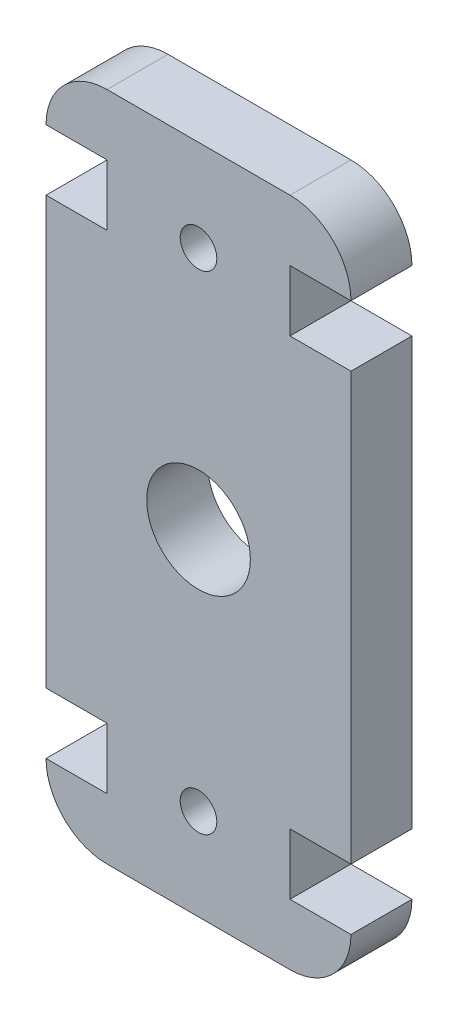
ISO-10303-21;
HEADER;
FILE_DESCRIPTION(('STEP AP214'),'2;1');
FILE_NAME('part.step','',(''),(''),'','','');
FILE_SCHEMA(('AUTOMOTIVE_DESIGN { 1 0 10303 214 1 1 1 1 }'));
ENDSEC;
DATA;
#1=APPLICATION_CONTEXT('core data for automotive mechanical design processes');
#2=APPLICATION_PROTOCOL_DEFINITION('international standard','automotive_design',2000,#1);
#3=PRODUCT_CONTEXT('',#1,'mechanical');
#4=PRODUCT('Part','Part','',(#3));
#5=PRODUCT_RELATED_PRODUCT_CATEGORY('part','',(#4));
#6=PRODUCT_DEFINITION_FORMATION('','',#4);
#7=PRODUCT_DEFINITION_CONTEXT('part definition',#1,'design');
#8=PRODUCT_DEFINITION('design','',#6,#7);
#9=PRODUCT_DEFINITION_SHAPE('','',#8);
#10=(LENGTH_UNIT() NAMED_UNIT(*) SI_UNIT(.MILLI.,.METRE.));
#11=(NAMED_UNIT(*) PLANE_ANGLE_UNIT() SI_UNIT($,.RADIAN.));
#12=(NAMED_UNIT(*) SI_UNIT($,.STERADIAN.) SOLID_ANGLE_UNIT());
#13=UNCERTAINTY_MEASURE_WITH_UNIT(LENGTH_MEASURE(1.E-05),#10,'distance_accuracy_value','');
#14=(GEOMETRIC_REPRESENTATION_CONTEXT(3) GLOBAL_UNCERTAINTY_ASSIGNED_CONTEXT((#13)) GLOBAL_UNIT_ASSIGNED_CONTEXT((#10,
#11,#12)) REPRESENTATION_CONTEXT('',''));
#15=CARTESIAN_POINT('',(0.,0.,0.));
#16=DIRECTION('',(0.,0.,1.));
#17=DIRECTION('',(1.,0.,0.));
#18=AXIS2_PLACEMENT_3D('',#15,#16,#17);
#19=CARTESIAN_POINT('',(0.,0.,5.));
#20=DIRECTION('',(0.,0.,1.));
#21=DIRECTION('',(1.,0.,0.));
#22=AXIS2_PLACEMENT_3D('',#19,#20,#21);
#23=PLANE('',#22);
#24=CARTESIAN_POINT('',(0.,7.5,5.));
#25=DIRECTION('',(0.,0.,1.));
#26=DIRECTION('',(1.,0.,0.));
#27=AXIS2_PLACEMENT_3D('',#24,#25,#26);
#28=CIRCLE('',#27,1.5);
#29=CARTESIAN_POINT('',(1.5,7.5,5.));
#30=VERTEX_POINT('',#29);
#31=EDGE_CURVE('E473',#30,#30,#28,.T.);
#32=ORIENTED_EDGE('',*,*,#31,.F.);
#33=EDGE_LOOP('',(#32));
#34=FACE_BOUND('',#33,.T.);
#35=DIRECTION('',(1.,0.,0.));
#36=VECTOR('',#35,1.);
#37=CARTESIAN_POINT('',(7.50000000000002,50.,5.));
#38=LINE('',#37,#36);
#39=CARTESIAN_POINT('',(7.50000000000002,50.,5.));
#40=VERTEX_POINT('',#39);
#41=CARTESIAN_POINT('',(12.4999999999999,50.,5.));
#42=VERTEX_POINT('',#41);
#43=EDGE_CURVE('E325',#40,#42,#38,.T.);
#44=ORIENTED_EDGE('',*,*,#43,.T.);
#45=CARTESIAN_POINT('',(7.49999999999994,50.,5.));
#46=DIRECTION('',(0.,0.,1.));
#47=DIRECTION('',(1.,0.,0.));
#48=AXIS2_PLACEMENT_3D('',#45,#46,#47);
#49=CIRCLE('',#48,5.);
#50=CARTESIAN_POINT('',(7.49999999999994,55.,5.));
#51=VERTEX_POINT('',#50);
#52=EDGE_CURVE('E174',#42,#51,#49,.T.);
#53=ORIENTED_EDGE('',*,*,#52,.T.);
#54=DIRECTION('',(-1.,0.,0.));
#55=VECTOR('',#54,1.);
#56=CARTESIAN_POINT('',(12.5,55.,5.));
#57=LINE('',#56,#55);
#58=CARTESIAN_POINT('',(-7.49999999999994,55.,5.));
#59=VERTEX_POINT('',#58);
#60=EDGE_CURVE('E331',#51,#59,#57,.T.);
#61=ORIENTED_EDGE('',*,*,#60,.T.);
#62=CARTESIAN_POINT('',(-7.49999999999994,50.,5.));
#63=DIRECTION('',(0.,0.,1.));
#64=DIRECTION('',(1.,0.,0.));
#65=AXIS2_PLACEMENT_3D('',#62,#63,#64);
#66=CIRCLE('',#65,5.);
#67=CARTESIAN_POINT('',(-12.4999999999999,50.,5.));
#68=VERTEX_POINT('',#67);
#69=EDGE_CURVE('E205',#59,#68,#66,.T.);
#70=ORIENTED_EDGE('',*,*,#69,.T.);
#71=DIRECTION('',(1.,0.,0.));
#72=VECTOR('',#71,1.);
#73=CARTESIAN_POINT('',(-12.4999999999999,50.,5.));
#74=LINE('',#73,#72);
#75=CARTESIAN_POINT('',(-7.50000000000013,50.,5.));
#76=VERTEX_POINT('',#75);
#77=EDGE_CURVE('E334',#68,#76,#74,.T.);
#78=ORIENTED_EDGE('',*,*,#77,.T.);
#79=DIRECTION('',(0.,-1.,0.));
#80=VECTOR('',#79,1.);
#81=CARTESIAN_POINT('',(-7.50000000000013,50.,5.));
#82=LINE('',#81,#80);
#83=CARTESIAN_POINT('',(-7.50000000000013,45.,5.));
#84=VERTEX_POINT('',#83);
#85=EDGE_CURVE('E336',#76,#84,#82,.T.);
#86=ORIENTED_EDGE('',*,*,#85,.T.);
#87=DIRECTION('',(-1.,0.,0.));
#88=VECTOR('',#87,1.);
#89=CARTESIAN_POINT('',(-7.50000000000013,45.,5.));
#90=LINE('',#89,#88);
#91=CARTESIAN_POINT('',(-12.4999999999999,45.,5.));
#92=VERTEX_POINT('',#91);
#93=EDGE_CURVE('E338',#84,#92,#90,.T.);
#94=ORIENTED_EDGE('',*,*,#93,.T.);
#95=DIRECTION('',(0.,-1.,0.));
#96=VECTOR('',#95,1.);
#97=CARTESIAN_POINT('',(-12.4999999999999,45.,5.));
#98=LINE('',#97,#96);
#99=CARTESIAN_POINT('',(-12.4999999999999,9.99999999999999,5.));
#100=VERTEX_POINT('',#99);
#101=EDGE_CURVE('E340',#92,#100,#98,.T.);
#102=ORIENTED_EDGE('',*,*,#101,.T.);
#103=DIRECTION('',(1.,0.,0.));
#104=VECTOR('',#103,1.);
#105=CARTESIAN_POINT('',(-12.4999999999999,9.99999999999999,5.));
#106=LINE('',#105,#104);
#107=CARTESIAN_POINT('',(-7.50000000000014,9.99999999999999,5.));
#108=VERTEX_POINT('',#107);
#109=EDGE_CURVE('E342',#100,#108,#106,.T.);
#110=ORIENTED_EDGE('',*,*,#109,.T.);
#111=DIRECTION('',(0.,-1.,0.));
#112=VECTOR('',#111,1.);
#113=CARTESIAN_POINT('',(-7.50000000000014,9.99999999999999,5.));
#114=LINE('',#113,#112);
#115=CARTESIAN_POINT('',(-7.49999999999997,5.,5.));
#116=VERTEX_POINT('',#115);
#117=EDGE_CURVE('E343',#108,#116,#114,.T.);
#118=ORIENTED_EDGE('',*,*,#117,.T.);
#119=DIRECTION('',(-1.,0.,0.));
#120=VECTOR('',#119,1.);
#121=CARTESIAN_POINT('',(-7.49999999999997,5.,5.));
#122=LINE('',#121,#120);
#123=CARTESIAN_POINT('',(-12.4999999999999,5.,5.));
#124=VERTEX_POINT('',#123);
#125=EDGE_CURVE('E229',#116,#124,#122,.T.);
#126=ORIENTED_EDGE('',*,*,#125,.T.);
#127=CARTESIAN_POINT('',(-7.49999999999994,5.,5.));
#128=DIRECTION('',(0.,0.,1.));
#129=DIRECTION('',(1.,0.,0.));
#130=AXIS2_PLACEMENT_3D('',#127,#128,#129);
#131=CIRCLE('',#130,5.);
#132=CARTESIAN_POINT('',(-7.49999999999994,0.,5.));
#133=VERTEX_POINT('',#132);
#134=EDGE_CURVE('E52',#124,#133,#131,.T.);
#135=ORIENTED_EDGE('',*,*,#134,.T.);
#136=DIRECTION('',(1.,0.,0.));
#137=VECTOR('',#136,1.);
#138=CARTESIAN_POINT('',(-12.4999999999999,0.,5.));
#139=LINE('',#138,#137);
#140=CARTESIAN_POINT('',(7.49999999999994,0.,5.));
#141=VERTEX_POINT('',#140);
#142=EDGE_CURVE('E171',#133,#141,#139,.T.);
#143=ORIENTED_EDGE('',*,*,#142,.T.);
#144=CARTESIAN_POINT('',(7.49999999999994,5.,5.));
#145=DIRECTION('',(0.,0.,1.));
#146=DIRECTION('',(1.,0.,0.));
#147=AXIS2_PLACEMENT_3D('',#144,#145,#146);
#148=CIRCLE('',#147,5.);
#149=CARTESIAN_POINT('',(12.4999999999999,5.,5.));
#150=VERTEX_POINT('',#149);
#151=EDGE_CURVE('E166',#141,#150,#148,.T.);
#152=ORIENTED_EDGE('',*,*,#151,.T.);
#153=DIRECTION('',(-1.,0.,0.));
#154=VECTOR('',#153,1.);
#155=CARTESIAN_POINT('',(12.4999999999999,5.,5.));
#156=LINE('',#155,#154);
#157=CARTESIAN_POINT('',(7.50000000000003,5.,5.));
#158=VERTEX_POINT('',#157);
#159=EDGE_CURVE('E169',#150,#158,#156,.T.);
#160=ORIENTED_EDGE('',*,*,#159,.T.);
#161=DIRECTION('',(0.,1.,0.));
#162=VECTOR('',#161,1.);
#163=CARTESIAN_POINT('',(7.50000000000003,5.,5.));
#164=LINE('',#163,#162);
#165=CARTESIAN_POINT('',(7.50000000000002,10.,5.));
#166=VERTEX_POINT('',#165);
#167=EDGE_CURVE('E184',#158,#166,#164,.T.);
#168=ORIENTED_EDGE('',*,*,#167,.T.);
#169=DIRECTION('',(1.,0.,0.));
#170=VECTOR('',#169,1.);
#171=CARTESIAN_POINT('',(7.50000000000002,10.,5.));
#172=LINE('',#171,#170);
#173=CARTESIAN_POINT('',(12.4999999999999,9.99999999999999,5.));
#174=VERTEX_POINT('',#173);
#175=EDGE_CURVE('E306',#166,#174,#172,.T.);
#176=ORIENTED_EDGE('',*,*,#175,.T.);
#177=DIRECTION('',(0.,1.,0.));
#178=VECTOR('',#177,1.);
#179=CARTESIAN_POINT('',(12.4999999999999,9.99999999999999,5.));
#180=LINE('',#179,#178);
#181=CARTESIAN_POINT('',(12.4999999999999,45.,5.));
#182=VERTEX_POINT('',#181);
#183=EDGE_CURVE('E323',#174,#182,#180,.T.);
#184=ORIENTED_EDGE('',*,*,#183,.T.);
#185=DIRECTION('',(-1.,0.,0.));
#186=VECTOR('',#185,1.);
#187=CARTESIAN_POINT('',(12.4999999999999,45.,5.));
#188=LINE('',#187,#186);
#189=CARTESIAN_POINT('',(7.50000000000006,45.,5.));
#190=VERTEX_POINT('',#189);
#191=EDGE_CURVE('E320',#182,#190,#188,.T.);
#192=ORIENTED_EDGE('',*,*,#191,.T.);
#193=DIRECTION('',(0.,1.,0.));
#194=VECTOR('',#193,1.);
#195=CARTESIAN_POINT('',(7.50000000000006,45.,5.));
#196=LINE('',#195,#194);
#197=EDGE_CURVE('E322',#190,#40,#196,.T.);
#198=ORIENTED_EDGE('',*,*,#197,.T.);
#199=EDGE_LOOP('',(#44,#53,#61,#70,#78,#86,#94,#102,#110,#118,#126,#135,#143,#152,#160,#168,
#176,#184,#192,#198));
#200=FACE_BOUND('',#199,.T.);
#201=CARTESIAN_POINT('',(0.,47.5000000000001,5.));
#202=DIRECTION('',(0.,0.,1.));
#203=DIRECTION('',(1.,0.,0.));
#204=AXIS2_PLACEMENT_3D('',#201,#202,#203);
#205=CIRCLE('',#204,1.5);
#206=CARTESIAN_POINT('',(1.5,47.5000000000001,5.));
#207=VERTEX_POINT('',#206);
#208=EDGE_CURVE('E221',#207,#207,#205,.T.);
#209=ORIENTED_EDGE('',*,*,#208,.F.);
#210=EDGE_LOOP('',(#209));
#211=FACE_BOUND('',#210,.T.);
#212=CARTESIAN_POINT('',(0.,27.5000000000001,5.));
#213=DIRECTION('',(0.,0.,1.));
#214=DIRECTION('',(1.,0.,0.));
#215=AXIS2_PLACEMENT_3D('',#212,#213,#214);
#216=CIRCLE('',#215,4.25);
#217=CARTESIAN_POINT('',(4.25,27.5000000000001,5.));
#218=VERTEX_POINT('',#217);
#219=EDGE_CURVE('E464',#218,#218,#216,.T.);
#220=ORIENTED_EDGE('',*,*,#219,.F.);
#221=EDGE_LOOP('',(#220));
#222=FACE_BOUND('',#221,.T.);
#223=ADVANCED_FACE('F32',(#34,#200,#211,#222),#23,.T.);
#224=CARTESIAN_POINT('',(0.,0.,0.));
#225=DIRECTION('',(0.,0.,1.));
#226=DIRECTION('',(1.,0.,0.));
#227=AXIS2_PLACEMENT_3D('',#224,#225,#226);
#228=PLANE('',#227);
#229=DIRECTION('',(-1.,0.,0.));
#230=VECTOR('',#229,1.);
#231=CARTESIAN_POINT('',(12.5,55.,0.));
#232=LINE('',#231,#230);
#233=CARTESIAN_POINT('',(7.49999999999994,55.,0.));
#234=VERTEX_POINT('',#233);
#235=CARTESIAN_POINT('',(-7.49999999999994,55.,0.));
#236=VERTEX_POINT('',#235);
#237=EDGE_CURVE('E244',#234,#236,#232,.T.);
#238=ORIENTED_EDGE('',*,*,#237,.F.);
#239=CARTESIAN_POINT('',(7.49999999999994,50.,0.));
#240=DIRECTION('',(0.,0.,1.));
#241=DIRECTION('',(1.,0.,0.));
#242=AXIS2_PLACEMENT_3D('',#239,#240,#241);
#243=CIRCLE('',#242,5.);
#244=CARTESIAN_POINT('',(12.4999999999999,50.,0.));
#245=VERTEX_POINT('',#244);
#246=EDGE_CURVE('E203',#234,#245,#243,.F.);
#247=ORIENTED_EDGE('',*,*,#246,.T.);
#248=DIRECTION('',(1.,0.,0.));
#249=VECTOR('',#248,1.);
#250=CARTESIAN_POINT('',(7.50000000000002,50.,0.));
#251=LINE('',#250,#249);
#252=CARTESIAN_POINT('',(7.50000000000002,50.,0.));
#253=VERTEX_POINT('',#252);
#254=EDGE_CURVE('E241',#253,#245,#251,.T.);
#255=ORIENTED_EDGE('',*,*,#254,.F.);
#256=DIRECTION('',(0.,1.,0.));
#257=VECTOR('',#256,1.);
#258=CARTESIAN_POINT('',(7.50000000000006,45.,0.));
#259=LINE('',#258,#257);
#260=CARTESIAN_POINT('',(7.50000000000006,45.,0.));
#261=VERTEX_POINT('',#260);
#262=EDGE_CURVE('E239',#261,#253,#259,.T.);
#263=ORIENTED_EDGE('',*,*,#262,.F.);
#264=DIRECTION('',(-1.,0.,0.));
#265=VECTOR('',#264,1.);
#266=CARTESIAN_POINT('',(12.4999999999999,45.,0.));
#267=LINE('',#266,#265);
#268=CARTESIAN_POINT('',(12.4999999999999,45.,0.));
#269=VERTEX_POINT('',#268);
#270=EDGE_CURVE('E237',#269,#261,#267,.T.);
#271=ORIENTED_EDGE('',*,*,#270,.F.);
#272=DIRECTION('',(0.,1.,0.));
#273=VECTOR('',#272,1.);
#274=CARTESIAN_POINT('',(12.4999999999999,9.99999999999999,0.));
#275=LINE('',#274,#273);
#276=CARTESIAN_POINT('',(12.4999999999999,9.99999999999999,0.));
#277=VERTEX_POINT('',#276);
#278=EDGE_CURVE('E235',#277,#269,#275,.T.);
#279=ORIENTED_EDGE('',*,*,#278,.F.);
#280=DIRECTION('',(1.,0.,0.));
#281=VECTOR('',#280,1.);
#282=CARTESIAN_POINT('',(7.50000000000002,10.,0.));
#283=LINE('',#282,#281);
#284=CARTESIAN_POINT('',(7.50000000000002,10.,0.));
#285=VERTEX_POINT('',#284);
#286=EDGE_CURVE('E233',#285,#277,#283,.T.);
#287=ORIENTED_EDGE('',*,*,#286,.F.);
#288=DIRECTION('',(0.,1.,0.));
#289=VECTOR('',#288,1.);
#290=CARTESIAN_POINT('',(7.50000000000003,5.,0.));
#291=LINE('',#290,#289);
#292=CARTESIAN_POINT('',(7.50000000000003,5.,0.));
#293=VERTEX_POINT('',#292);
#294=EDGE_CURVE('E223',#293,#285,#291,.T.);
#295=ORIENTED_EDGE('',*,*,#294,.F.);
#296=DIRECTION('',(-1.,0.,0.));
#297=VECTOR('',#296,1.);
#298=CARTESIAN_POINT('',(12.4999999999999,5.,0.));
#299=LINE('',#298,#297);
#300=CARTESIAN_POINT('',(12.4999999999999,5.,0.));
#301=VERTEX_POINT('',#300);
#302=EDGE_CURVE('E220',#301,#293,#299,.T.);
#303=ORIENTED_EDGE('',*,*,#302,.F.);
#304=CARTESIAN_POINT('',(7.49999999999994,5.,0.));
#305=DIRECTION('',(0.,0.,1.));
#306=DIRECTION('',(1.,0.,0.));
#307=AXIS2_PLACEMENT_3D('',#304,#305,#306);
#308=CIRCLE('',#307,5.);
#309=CARTESIAN_POINT('',(7.49999999999994,0.,0.));
#310=VERTEX_POINT('',#309);
#311=EDGE_CURVE('E187',#301,#310,#308,.F.);
#312=ORIENTED_EDGE('',*,*,#311,.T.);
#313=DIRECTION('',(1.,0.,0.));
#314=VECTOR('',#313,1.);
#315=CARTESIAN_POINT('',(-12.4999999999999,0.,0.));
#316=LINE('',#315,#314);
#317=CARTESIAN_POINT('',(-7.49999999999994,0.,0.));
#318=VERTEX_POINT('',#317);
#319=EDGE_CURVE('E212',#318,#310,#316,.T.);
#320=ORIENTED_EDGE('',*,*,#319,.F.);
#321=CARTESIAN_POINT('',(-7.49999999999994,5.,0.));
#322=DIRECTION('',(0.,0.,1.));
#323=DIRECTION('',(1.,0.,0.));
#324=AXIS2_PLACEMENT_3D('',#321,#322,#323);
#325=CIRCLE('',#324,5.);
#326=CARTESIAN_POINT('',(-12.4999999999999,5.,0.));
#327=VERTEX_POINT('',#326);
#328=EDGE_CURVE('E200',#318,#327,#325,.F.);
#329=ORIENTED_EDGE('',*,*,#328,.T.);
#330=DIRECTION('',(-1.,0.,0.));
#331=VECTOR('',#330,1.);
#332=CARTESIAN_POINT('',(-7.49999999999997,5.,0.));
#333=LINE('',#332,#331);
#334=CARTESIAN_POINT('',(-7.49999999999997,5.,0.));
#335=VERTEX_POINT('',#334);
#336=EDGE_CURVE('E259',#335,#327,#333,.T.);
#337=ORIENTED_EDGE('',*,*,#336,.F.);
#338=DIRECTION('',(0.,-1.,0.));
#339=VECTOR('',#338,1.);
#340=CARTESIAN_POINT('',(-7.50000000000014,9.99999999999999,0.));
#341=LINE('',#340,#339);
#342=CARTESIAN_POINT('',(-7.50000000000014,9.99999999999999,0.));
#343=VERTEX_POINT('',#342);
#344=EDGE_CURVE('E257',#343,#335,#341,.T.);
#345=ORIENTED_EDGE('',*,*,#344,.F.);
#346=DIRECTION('',(1.,0.,0.));
#347=VECTOR('',#346,1.);
#348=CARTESIAN_POINT('',(-12.4999999999999,9.99999999999999,0.));
#349=LINE('',#348,#347);
#350=CARTESIAN_POINT('',(-12.4999999999999,9.99999999999999,0.));
#351=VERTEX_POINT('',#350);
#352=EDGE_CURVE('E255',#351,#343,#349,.T.);
#353=ORIENTED_EDGE('',*,*,#352,.F.);
#354=DIRECTION('',(0.,-1.,0.));
#355=VECTOR('',#354,1.);
#356=CARTESIAN_POINT('',(-12.4999999999999,45.,0.));
#357=LINE('',#356,#355);
#358=CARTESIAN_POINT('',(-12.4999999999999,45.,0.));
#359=VERTEX_POINT('',#358);
#360=EDGE_CURVE('E253',#359,#351,#357,.T.);
#361=ORIENTED_EDGE('',*,*,#360,.F.);
#362=DIRECTION('',(-1.,0.,0.));
#363=VECTOR('',#362,1.);
#364=CARTESIAN_POINT('',(-7.50000000000013,45.,0.));
#365=LINE('',#364,#363);
#366=CARTESIAN_POINT('',(-7.50000000000013,45.,0.));
#367=VERTEX_POINT('',#366);
#368=EDGE_CURVE('E251',#367,#359,#365,.T.);
#369=ORIENTED_EDGE('',*,*,#368,.F.);
#370=DIRECTION('',(0.,-1.,0.));
#371=VECTOR('',#370,1.);
#372=CARTESIAN_POINT('',(-7.50000000000013,50.,0.));
#373=LINE('',#372,#371);
#374=CARTESIAN_POINT('',(-7.50000000000013,50.,0.));
#375=VERTEX_POINT('',#374);
#376=EDGE_CURVE('E249',#375,#367,#373,.T.);
#377=ORIENTED_EDGE('',*,*,#376,.F.);
#378=DIRECTION('',(1.,0.,0.));
#379=VECTOR('',#378,1.);
#380=CARTESIAN_POINT('',(-12.4999999999999,50.,0.));
#381=LINE('',#380,#379);
#382=CARTESIAN_POINT('',(-12.4999999999999,50.,0.));
#383=VERTEX_POINT('',#382);
#384=EDGE_CURVE('E247',#383,#375,#381,.T.);
#385=ORIENTED_EDGE('',*,*,#384,.F.);
#386=CARTESIAN_POINT('',(-7.49999999999994,50.,0.));
#387=DIRECTION('',(0.,0.,1.));
#388=DIRECTION('',(1.,0.,0.));
#389=AXIS2_PLACEMENT_3D('',#386,#387,#388);
#390=CIRCLE('',#389,5.);
#391=EDGE_CURVE('E198',#383,#236,#390,.F.);
#392=ORIENTED_EDGE('',*,*,#391,.T.);
#393=EDGE_LOOP('',(#238,#247,#255,#263,#271,#279,#287,#295,#303,#312,#320,#329,#337,#345,#353,
#361,#369,#377,#385,#392));
#394=FACE_BOUND('',#393,.T.);
#395=CARTESIAN_POINT('',(0.,47.5000000000001,0.));
#396=DIRECTION('',(0.,0.,1.));
#397=DIRECTION('',(1.,0.,0.));
#398=AXIS2_PLACEMENT_3D('',#395,#396,#397);
#399=CIRCLE('',#398,1.5);
#400=CARTESIAN_POINT('',(1.5,47.5000000000001,0.));
#401=VERTEX_POINT('',#400);
#402=EDGE_CURVE('E226',#401,#401,#399,.T.);
#403=ORIENTED_EDGE('',*,*,#402,.T.);
#404=EDGE_LOOP('',(#403));
#405=FACE_BOUND('',#404,.T.);
#406=CARTESIAN_POINT('',(0.,7.5,0.));
#407=DIRECTION('',(0.,0.,1.));
#408=DIRECTION('',(1.,0.,0.));
#409=AXIS2_PLACEMENT_3D('',#406,#407,#408);
#410=CIRCLE('',#409,1.5);
#411=CARTESIAN_POINT('',(1.5,7.5,0.));
#412=VERTEX_POINT('',#411);
#413=EDGE_CURVE('E470',#412,#412,#410,.T.);
#414=ORIENTED_EDGE('',*,*,#413,.T.);
#415=EDGE_LOOP('',(#414));
#416=FACE_BOUND('',#415,.T.);
#417=CARTESIAN_POINT('',(0.,27.5000000000001,0.));
#418=DIRECTION('',(0.,0.,1.));
#419=DIRECTION('',(1.,0.,0.));
#420=AXIS2_PLACEMENT_3D('',#417,#418,#419);
#421=CIRCLE('',#420,4.25);
#422=CARTESIAN_POINT('',(4.25,27.5000000000001,0.));
#423=VERTEX_POINT('',#422);
#424=EDGE_CURVE('E467',#423,#423,#421,.T.);
#425=ORIENTED_EDGE('',*,*,#424,.T.);
#426=EDGE_LOOP('',(#425));
#427=FACE_BOUND('',#426,.T.);
#428=ADVANCED_FACE('F216',(#394,#405,#416,#427),#228,.F.);
#429=CARTESIAN_POINT('',(-12.4999999999999,0.,5.));
#430=DIRECTION('',(0.,1.,0.));
#431=DIRECTION('',(0.,0.,1.));
#432=AXIS2_PLACEMENT_3D('',#429,#430,#431);
#433=PLANE('',#432);
#434=ORIENTED_EDGE('',*,*,#319,.T.);
#435=DIRECTION('',(0.,0.,-1.));
#436=VECTOR('',#435,1.);
#437=CARTESIAN_POINT('',(7.49999999999994,0.,5.));
#438=LINE('',#437,#436);
#439=EDGE_CURVE('E11',#310,#141,#438,.F.);
#440=ORIENTED_EDGE('',*,*,#439,.T.);
#441=ORIENTED_EDGE('',*,*,#142,.F.);
#442=DIRECTION('',(0.,0.,-1.));
#443=VECTOR('',#442,1.);
#444=CARTESIAN_POINT('',(-7.49999999999994,0.,5.));
#445=LINE('',#444,#443);
#446=EDGE_CURVE('E40',#133,#318,#445,.T.);
#447=ORIENTED_EDGE('',*,*,#446,.T.);
#448=EDGE_LOOP('',(#434,#440,#441,#447));
#449=FACE_BOUND('',#448,.T.);
#450=ADVANCED_FACE('F211',(#449),#433,.F.);
#451=CARTESIAN_POINT('',(12.4999999999999,5.,5.));
#452=DIRECTION('',(0.,-1.,0.));
#453=DIRECTION('',(1.,0.,0.));
#454=AXIS2_PLACEMENT_3D('',#451,#452,#453);
#455=PLANE('',#454);
#456=ORIENTED_EDGE('',*,*,#302,.T.);
#457=DIRECTION('',(0.,0.,-1.));
#458=VECTOR('',#457,1.);
#459=CARTESIAN_POINT('',(7.50000000000003,5.,5.));
#460=LINE('',#459,#458);
#461=EDGE_CURVE('E182',#158,#293,#460,.T.);
#462=ORIENTED_EDGE('',*,*,#461,.F.);
#463=ORIENTED_EDGE('',*,*,#159,.F.);
#464=DIRECTION('',(0.,0.,-1.));
#465=VECTOR('',#464,1.);
#466=CARTESIAN_POINT('',(12.4999999999999,5.,5.));
#467=LINE('',#466,#465);
#468=EDGE_CURVE('E179',#150,#301,#467,.T.);
#469=ORIENTED_EDGE('',*,*,#468,.T.);
#470=EDGE_LOOP('',(#456,#462,#463,#469));
#471=FACE_BOUND('',#470,.T.);
#472=ADVANCED_FACE('F178',(#471),#455,.F.);
#473=CARTESIAN_POINT('',(7.50000000000003,5.,5.));
#474=DIRECTION('',(-1.,0.,0.));
#475=DIRECTION('',(0.,-1.,0.));
#476=AXIS2_PLACEMENT_3D('',#473,#474,#475);
#477=PLANE('',#476);
#478=ORIENTED_EDGE('',*,*,#294,.T.);
#479=DIRECTION('',(0.,0.,-1.));
#480=VECTOR('',#479,1.);
#481=CARTESIAN_POINT('',(7.50000000000002,10.,5.));
#482=LINE('',#481,#480);
#483=EDGE_CURVE('E192',#166,#285,#482,.T.);
#484=ORIENTED_EDGE('',*,*,#483,.F.);
#485=ORIENTED_EDGE('',*,*,#167,.F.);
#486=ORIENTED_EDGE('',*,*,#461,.T.);
#487=EDGE_LOOP('',(#478,#484,#485,#486));
#488=FACE_BOUND('',#487,.T.);
#489=ADVANCED_FACE('F415',(#488),#477,.F.);
#490=CARTESIAN_POINT('',(7.50000000000002,10.,5.));
#491=DIRECTION('',(0.,1.,0.));
#492=DIRECTION('',(-1.,0.,0.));
#493=AXIS2_PLACEMENT_3D('',#490,#491,#492);
#494=PLANE('',#493);
#495=ORIENTED_EDGE('',*,*,#286,.T.);
#496=DIRECTION('',(0.,0.,-1.));
#497=VECTOR('',#496,1.);
#498=CARTESIAN_POINT('',(12.4999999999999,9.99999999999999,5.));
#499=LINE('',#498,#497);
#500=EDGE_CURVE('E297',#174,#277,#499,.T.);
#501=ORIENTED_EDGE('',*,*,#500,.F.);
#502=ORIENTED_EDGE('',*,*,#175,.F.);
#503=ORIENTED_EDGE('',*,*,#483,.T.);
#504=EDGE_LOOP('',(#495,#501,#502,#503));
#505=FACE_BOUND('',#504,.T.);
#506=ADVANCED_FACE('F304',(#505),#494,.F.);
#507=CARTESIAN_POINT('',(12.4999999999999,9.99999999999999,5.));
#508=DIRECTION('',(-1.,0.,0.));
#509=DIRECTION('',(0.,0.,1.));
#510=AXIS2_PLACEMENT_3D('',#507,#508,#509);
#511=PLANE('',#510);
#512=ORIENTED_EDGE('',*,*,#278,.T.);
#513=DIRECTION('',(0.,0.,-1.));
#514=VECTOR('',#513,1.);
#515=CARTESIAN_POINT('',(12.4999999999999,45.,5.));
#516=LINE('',#515,#514);
#517=EDGE_CURVE('E294',#182,#269,#516,.T.);
#518=ORIENTED_EDGE('',*,*,#517,.F.);
#519=ORIENTED_EDGE('',*,*,#183,.F.);
#520=ORIENTED_EDGE('',*,*,#500,.T.);
#521=EDGE_LOOP('',(#512,#518,#519,#520));
#522=FACE_BOUND('',#521,.T.);
#523=ADVANCED_FACE('F314',(#522),#511,.F.);
#524=CARTESIAN_POINT('',(12.4999999999999,45.,5.));
#525=DIRECTION('',(0.,-1.,0.));
#526=DIRECTION('',(1.,0.,0.));
#527=AXIS2_PLACEMENT_3D('',#524,#525,#526);
#528=PLANE('',#527);
#529=ORIENTED_EDGE('',*,*,#270,.T.);
#530=DIRECTION('',(0.,0.,-1.));
#531=VECTOR('',#530,1.);
#532=CARTESIAN_POINT('',(7.50000000000006,45.,5.));
#533=LINE('',#532,#531);
#534=EDGE_CURVE('E291',#190,#261,#533,.T.);
#535=ORIENTED_EDGE('',*,*,#534,.F.);
#536=ORIENTED_EDGE('',*,*,#191,.F.);
#537=ORIENTED_EDGE('',*,*,#517,.T.);
#538=EDGE_LOOP('',(#529,#535,#536,#537));
#539=FACE_BOUND('',#538,.T.);
#540=ADVANCED_FACE('F318',(#539),#528,.F.);
#541=CARTESIAN_POINT('',(7.50000000000006,45.,5.));
#542=DIRECTION('',(-1.,0.,0.));
#543=DIRECTION('',(0.,-1.,0.));
#544=AXIS2_PLACEMENT_3D('',#541,#542,#543);
#545=PLANE('',#544);
#546=ORIENTED_EDGE('',*,*,#262,.T.);
#547=DIRECTION('',(0.,0.,-1.));
#548=VECTOR('',#547,1.);
#549=CARTESIAN_POINT('',(7.50000000000002,50.,5.));
#550=LINE('',#549,#548);
#551=EDGE_CURVE('E288',#40,#253,#550,.T.);
#552=ORIENTED_EDGE('',*,*,#551,.F.);
#553=ORIENTED_EDGE('',*,*,#197,.F.);
#554=ORIENTED_EDGE('',*,*,#534,.T.);
#555=EDGE_LOOP('',(#546,#552,#553,#554));
#556=FACE_BOUND('',#555,.T.);
#557=ADVANCED_FACE('F404',(#556),#545,.F.);
#558=CARTESIAN_POINT('',(7.50000000000002,50.,5.));
#559=DIRECTION('',(0.,1.,0.));
#560=DIRECTION('',(0.,0.,1.));
#561=AXIS2_PLACEMENT_3D('',#558,#559,#560);
#562=PLANE('',#561);
#563=ORIENTED_EDGE('',*,*,#254,.T.);
#564=DIRECTION('',(0.,0.,-1.));
#565=VECTOR('',#564,1.);
#566=CARTESIAN_POINT('',(12.4999999999999,50.,5.));
#567=LINE('',#566,#565);
#568=EDGE_CURVE('E285',#42,#245,#567,.T.);
#569=ORIENTED_EDGE('',*,*,#568,.F.);
#570=ORIENTED_EDGE('',*,*,#43,.F.);
#571=ORIENTED_EDGE('',*,*,#551,.T.);
#572=EDGE_LOOP('',(#563,#569,#570,#571));
#573=FACE_BOUND('',#572,.T.);
#574=ADVANCED_FACE('F400',(#573),#562,.F.);
#575=CARTESIAN_POINT('',(12.5,55.,5.));
#576=DIRECTION('',(0.,-1.,0.));
#577=DIRECTION('',(0.,0.,-1.));
#578=AXIS2_PLACEMENT_3D('',#575,#576,#577);
#579=PLANE('',#578);
#580=ORIENTED_EDGE('',*,*,#60,.F.);
#581=DIRECTION('',(0.,0.,-1.));
#582=VECTOR('',#581,1.);
#583=CARTESIAN_POINT('',(7.49999999999994,55.,5.));
#584=LINE('',#583,#582);
#585=EDGE_CURVE('E190',#51,#234,#584,.T.);
#586=ORIENTED_EDGE('',*,*,#585,.T.);
#587=ORIENTED_EDGE('',*,*,#237,.T.);
#588=DIRECTION('',(0.,0.,-1.));
#589=VECTOR('',#588,1.);
#590=CARTESIAN_POINT('',(-7.49999999999994,55.,5.));
#591=LINE('',#590,#589);
#592=EDGE_CURVE('E188',#236,#59,#591,.F.);
#593=ORIENTED_EDGE('',*,*,#592,.T.);
#594=EDGE_LOOP('',(#580,#586,#587,#593));
#595=FACE_BOUND('',#594,.T.);
#596=ADVANCED_FACE('F396',(#595),#579,.F.);
#597=CARTESIAN_POINT('',(-12.4999999999999,50.,5.));
#598=DIRECTION('',(0.,1.,0.));
#599=DIRECTION('',(-1.,0.,0.));
#600=AXIS2_PLACEMENT_3D('',#597,#598,#599);
#601=PLANE('',#600);
#602=ORIENTED_EDGE('',*,*,#384,.T.);
#603=DIRECTION('',(0.,0.,-1.));
#604=VECTOR('',#603,1.);
#605=CARTESIAN_POINT('',(-7.50000000000013,50.,5.));
#606=LINE('',#605,#604);
#607=EDGE_CURVE('E279',#76,#375,#606,.T.);
#608=ORIENTED_EDGE('',*,*,#607,.F.);
#609=ORIENTED_EDGE('',*,*,#77,.F.);
#610=DIRECTION('',(0.,0.,-1.));
#611=VECTOR('',#610,1.);
#612=CARTESIAN_POINT('',(-12.4999999999999,50.,5.));
#613=LINE('',#612,#611);
#614=EDGE_CURVE('E282',#68,#383,#613,.T.);
#615=ORIENTED_EDGE('',*,*,#614,.T.);
#616=EDGE_LOOP('',(#602,#608,#609,#615));
#617=FACE_BOUND('',#616,.T.);
#618=ADVANCED_FACE('F392',(#617),#601,.F.);
#619=CARTESIAN_POINT('',(-7.50000000000013,50.,5.));
#620=DIRECTION('',(1.,0.,0.));
#621=DIRECTION('',(0.,1.,0.));
#622=AXIS2_PLACEMENT_3D('',#619,#620,#621);
#623=PLANE('',#622);
#624=ORIENTED_EDGE('',*,*,#376,.T.);
#625=DIRECTION('',(0.,0.,-1.));
#626=VECTOR('',#625,1.);
#627=CARTESIAN_POINT('',(-7.50000000000013,45.,5.));
#628=LINE('',#627,#626);
#629=EDGE_CURVE('E276',#84,#367,#628,.T.);
#630=ORIENTED_EDGE('',*,*,#629,.F.);
#631=ORIENTED_EDGE('',*,*,#85,.F.);
#632=ORIENTED_EDGE('',*,*,#607,.T.);
#633=EDGE_LOOP('',(#624,#630,#631,#632));
#634=FACE_BOUND('',#633,.T.);
#635=ADVANCED_FACE('F388',(#634),#623,.F.);
#636=CARTESIAN_POINT('',(-7.50000000000013,45.,5.));
#637=DIRECTION('',(0.,-1.,0.));
#638=DIRECTION('',(1.,0.,0.));
#639=AXIS2_PLACEMENT_3D('',#636,#637,#638);
#640=PLANE('',#639);
#641=ORIENTED_EDGE('',*,*,#368,.T.);
#642=DIRECTION('',(0.,0.,-1.));
#643=VECTOR('',#642,1.);
#644=CARTESIAN_POINT('',(-12.4999999999999,45.,5.));
#645=LINE('',#644,#643);
#646=EDGE_CURVE('E273',#92,#359,#645,.T.);
#647=ORIENTED_EDGE('',*,*,#646,.F.);
#648=ORIENTED_EDGE('',*,*,#93,.F.);
#649=ORIENTED_EDGE('',*,*,#629,.T.);
#650=EDGE_LOOP('',(#641,#647,#648,#649));
#651=FACE_BOUND('',#650,.T.);
#652=ADVANCED_FACE('F384',(#651),#640,.F.);
#653=CARTESIAN_POINT('',(-12.4999999999999,45.,5.));
#654=DIRECTION('',(1.,0.,0.));
#655=DIRECTION('',(0.,0.,-1.));
#656=AXIS2_PLACEMENT_3D('',#653,#654,#655);
#657=PLANE('',#656);
#658=ORIENTED_EDGE('',*,*,#360,.T.);
#659=DIRECTION('',(0.,0.,-1.));
#660=VECTOR('',#659,1.);
#661=CARTESIAN_POINT('',(-12.4999999999999,9.99999999999999,5.));
#662=LINE('',#661,#660);
#663=EDGE_CURVE('E270',#100,#351,#662,.T.);
#664=ORIENTED_EDGE('',*,*,#663,.F.);
#665=ORIENTED_EDGE('',*,*,#101,.F.);
#666=ORIENTED_EDGE('',*,*,#646,.T.);
#667=EDGE_LOOP('',(#658,#664,#665,#666));
#668=FACE_BOUND('',#667,.T.);
#669=ADVANCED_FACE('F380',(#668),#657,.F.);
#670=CARTESIAN_POINT('',(-12.4999999999999,9.99999999999999,5.));
#671=DIRECTION('',(0.,1.,0.));
#672=DIRECTION('',(-1.,0.,0.));
#673=AXIS2_PLACEMENT_3D('',#670,#671,#672);
#674=PLANE('',#673);
#675=ORIENTED_EDGE('',*,*,#352,.T.);
#676=DIRECTION('',(0.,0.,-1.));
#677=VECTOR('',#676,1.);
#678=CARTESIAN_POINT('',(-7.50000000000014,9.99999999999999,5.));
#679=LINE('',#678,#677);
#680=EDGE_CURVE('E267',#108,#343,#679,.T.);
#681=ORIENTED_EDGE('',*,*,#680,.F.);
#682=ORIENTED_EDGE('',*,*,#109,.F.);
#683=ORIENTED_EDGE('',*,*,#663,.T.);
#684=EDGE_LOOP('',(#675,#681,#682,#683));
#685=FACE_BOUND('',#684,.T.);
#686=ADVANCED_FACE('F376',(#685),#674,.F.);
#687=CARTESIAN_POINT('',(-7.50000000000014,9.99999999999999,5.));
#688=DIRECTION('',(1.,0.,0.));
#689=DIRECTION('',(0.,1.,0.));
#690=AXIS2_PLACEMENT_3D('',#687,#688,#689);
#691=PLANE('',#690);
#692=ORIENTED_EDGE('',*,*,#344,.T.);
#693=DIRECTION('',(0.,0.,-1.));
#694=VECTOR('',#693,1.);
#695=CARTESIAN_POINT('',(-7.49999999999997,5.,5.));
#696=LINE('',#695,#694);
#697=EDGE_CURVE('E264',#116,#335,#696,.T.);
#698=ORIENTED_EDGE('',*,*,#697,.F.);
#699=ORIENTED_EDGE('',*,*,#117,.F.);
#700=ORIENTED_EDGE('',*,*,#680,.T.);
#701=EDGE_LOOP('',(#692,#698,#699,#700));
#702=FACE_BOUND('',#701,.T.);
#703=ADVANCED_FACE('F373',(#702),#691,.F.);
#704=CARTESIAN_POINT('',(-7.49999999999997,5.,5.));
#705=DIRECTION('',(0.,-1.,0.));
#706=DIRECTION('',(1.,0.,0.));
#707=AXIS2_PLACEMENT_3D('',#704,#705,#706);
#708=PLANE('',#707);
#709=ORIENTED_EDGE('',*,*,#336,.T.);
#710=DIRECTION('',(0.,0.,-1.));
#711=VECTOR('',#710,1.);
#712=CARTESIAN_POINT('',(-12.4999999999999,5.,5.));
#713=LINE('',#712,#711);
#714=EDGE_CURVE('E261',#124,#327,#713,.T.);
#715=ORIENTED_EDGE('',*,*,#714,.F.);
#716=ORIENTED_EDGE('',*,*,#125,.F.);
#717=ORIENTED_EDGE('',*,*,#697,.T.);
#718=EDGE_LOOP('',(#709,#715,#716,#717));
#719=FACE_BOUND('',#718,.T.);
#720=ADVANCED_FACE('F349',(#719),#708,.F.);
#721=CARTESIAN_POINT('',(0.,47.5000000000001,5.));
#722=DIRECTION('',(0.,0.,-1.));
#723=DIRECTION('',(-1.,0.,0.));
#724=AXIS2_PLACEMENT_3D('',#721,#722,#723);
#725=CYLINDRICAL_SURFACE('',#724,1.5);
#726=ORIENTED_EDGE('',*,*,#208,.T.);
#727=EDGE_LOOP('',(#726));
#728=FACE_BOUND('',#727,.T.);
#729=ORIENTED_EDGE('',*,*,#402,.F.);
#730=EDGE_LOOP('',(#729));
#731=FACE_BOUND('',#730,.T.);
#732=ADVANCED_FACE('F368',(#728,#731),#725,.F.);
#733=CARTESIAN_POINT('',(0.,7.5,5.));
#734=DIRECTION('',(0.,0.,-1.));
#735=DIRECTION('',(-1.,0.,0.));
#736=AXIS2_PLACEMENT_3D('',#733,#734,#735);
#737=CYLINDRICAL_SURFACE('',#736,1.5);
#738=ORIENTED_EDGE('',*,*,#31,.T.);
#739=EDGE_LOOP('',(#738));
#740=FACE_BOUND('',#739,.T.);
#741=ORIENTED_EDGE('',*,*,#413,.F.);
#742=EDGE_LOOP('',(#741));
#743=FACE_BOUND('',#742,.T.);
#744=ADVANCED_FACE('F428',(#740,#743),#737,.F.);
#745=CARTESIAN_POINT('',(0.,27.5000000000001,5.));
#746=DIRECTION('',(0.,0.,-1.));
#747=DIRECTION('',(-1.,0.,0.));
#748=AXIS2_PLACEMENT_3D('',#745,#746,#747);
#749=CYLINDRICAL_SURFACE('',#748,4.25);
#750=ORIENTED_EDGE('',*,*,#219,.T.);
#751=EDGE_LOOP('',(#750));
#752=FACE_BOUND('',#751,.T.);
#753=ORIENTED_EDGE('',*,*,#424,.F.);
#754=EDGE_LOOP('',(#753));
#755=FACE_BOUND('',#754,.T.);
#756=ADVANCED_FACE('F423',(#752,#755),#749,.F.);
#757=CARTESIAN_POINT('',(7.49999999999994,50.,5.));
#758=DIRECTION('',(0.,0.,-1.));
#759=DIRECTION('',(-1.,0.,0.));
#760=AXIS2_PLACEMENT_3D('',#757,#758,#759);
#761=CYLINDRICAL_SURFACE('',#760,5.);
#762=ORIENTED_EDGE('',*,*,#52,.F.);
#763=ORIENTED_EDGE('',*,*,#568,.T.);
#764=ORIENTED_EDGE('',*,*,#246,.F.);
#765=ORIENTED_EDGE('',*,*,#585,.F.);
#766=EDGE_LOOP('',(#762,#763,#764,#765));
#767=FACE_BOUND('',#766,.T.);
#768=ADVANCED_FACE('F357',(#767),#761,.T.);
#769=CARTESIAN_POINT('',(7.49999999999994,5.,5.));
#770=DIRECTION('',(0.,0.,-1.));
#771=DIRECTION('',(-1.,0.,0.));
#772=AXIS2_PLACEMENT_3D('',#769,#770,#771);
#773=CYLINDRICAL_SURFACE('',#772,5.);
#774=ORIENTED_EDGE('',*,*,#151,.F.);
#775=ORIENTED_EDGE('',*,*,#439,.F.);
#776=ORIENTED_EDGE('',*,*,#311,.F.);
#777=ORIENTED_EDGE('',*,*,#468,.F.);
#778=EDGE_LOOP('',(#774,#775,#776,#777));
#779=FACE_BOUND('',#778,.T.);
#780=ADVANCED_FACE('F186',(#779),#773,.T.);
#781=CARTESIAN_POINT('',(-7.49999999999994,5.,5.));
#782=DIRECTION('',(0.,0.,-1.));
#783=DIRECTION('',(-1.,0.,0.));
#784=AXIS2_PLACEMENT_3D('',#781,#782,#783);
#785=CYLINDRICAL_SURFACE('',#784,5.);
#786=ORIENTED_EDGE('',*,*,#134,.F.);
#787=ORIENTED_EDGE('',*,*,#714,.T.);
#788=ORIENTED_EDGE('',*,*,#328,.F.);
#789=ORIENTED_EDGE('',*,*,#446,.F.);
#790=EDGE_LOOP('',(#786,#787,#788,#789));
#791=FACE_BOUND('',#790,.T.);
#792=ADVANCED_FACE('F350',(#791),#785,.T.);
#793=CARTESIAN_POINT('',(-7.49999999999994,50.,5.));
#794=DIRECTION('',(0.,0.,-1.));
#795=DIRECTION('',(-1.,0.,0.));
#796=AXIS2_PLACEMENT_3D('',#793,#794,#795);
#797=CYLINDRICAL_SURFACE('',#796,5.);
#798=ORIENTED_EDGE('',*,*,#69,.F.);
#799=ORIENTED_EDGE('',*,*,#592,.F.);
#800=ORIENTED_EDGE('',*,*,#391,.F.);
#801=ORIENTED_EDGE('',*,*,#614,.F.);
#802=EDGE_LOOP('',(#798,#799,#800,#801));
#803=FACE_BOUND('',#802,.T.);
#804=ADVANCED_FACE('F34',(#803),#797,.T.);
#805=CLOSED_SHELL('',(#223,#428,#450,#472,#489,#506,#523,#540,#557,#574,#596,#618,#635,#652,
#669,#686,#703,#720,#732,#744,#756,#768,#780,#792,#804));
#806=MANIFOLD_SOLID_BREP('B2',#805);
#807=ADVANCED_BREP_SHAPE_REPRESENTATION('',(#18,#806),#14);
#808=SHAPE_DEFINITION_REPRESENTATION(#9,#807);
ENDSEC;
END-ISO-10303-21;
